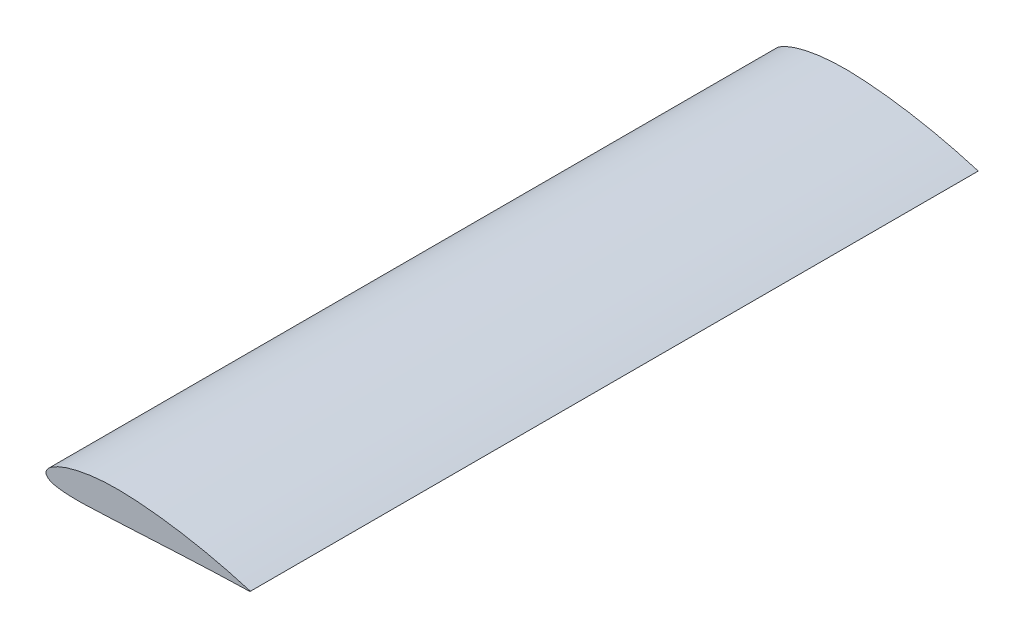
ISO-10303-21;
HEADER;
FILE_DESCRIPTION(('STEP AP214'),'2;1');
FILE_NAME('part.step','',(''),(''),'','','');
FILE_SCHEMA(('AUTOMOTIVE_DESIGN { 1 0 10303 214 1 1 1 1 }'));
ENDSEC;
DATA;
#1=APPLICATION_CONTEXT('core data for automotive mechanical design processes');
#2=APPLICATION_PROTOCOL_DEFINITION('international standard','automotive_design',2000,#1);
#3=PRODUCT_CONTEXT('',#1,'mechanical');
#4=PRODUCT('Part','Part','',(#3));
#5=PRODUCT_RELATED_PRODUCT_CATEGORY('part','',(#4));
#6=PRODUCT_DEFINITION_FORMATION('','',#4);
#7=PRODUCT_DEFINITION_CONTEXT('part definition',#1,'design');
#8=PRODUCT_DEFINITION('design','',#6,#7);
#9=PRODUCT_DEFINITION_SHAPE('','',#8);
#10=(LENGTH_UNIT() NAMED_UNIT(*) SI_UNIT(.MILLI.,.METRE.));
#11=(NAMED_UNIT(*) PLANE_ANGLE_UNIT() SI_UNIT($,.RADIAN.));
#12=(NAMED_UNIT(*) SI_UNIT($,.STERADIAN.) SOLID_ANGLE_UNIT());
#13=UNCERTAINTY_MEASURE_WITH_UNIT(LENGTH_MEASURE(1.E-05),#10,'distance_accuracy_value','');
#14=(GEOMETRIC_REPRESENTATION_CONTEXT(3) GLOBAL_UNCERTAINTY_ASSIGNED_CONTEXT((#13)) GLOBAL_UNIT_ASSIGNED_CONTEXT((#10,
#11,#12)) REPRESENTATION_CONTEXT('',''));
#15=CARTESIAN_POINT('',(0.,0.,0.));
#16=DIRECTION('',(0.,0.,1.));
#17=DIRECTION('',(1.,0.,0.));
#18=AXIS2_PLACEMENT_3D('',#15,#16,#17);
#19=CARTESIAN_POINT('',(0.404826448585652,2.27763507900381,500.));
#20=DIRECTION('',(0.,0.,-1.));
#21=DIRECTION('',(-1.,0.,0.));
#22=AXIS2_PLACEMENT_3D('',#19,#20,#21);
#23=PLANE('',#22);
#24=CARTESIAN_POINT('',(140.02716,0.203980000000014,500.));
#25=CARTESIAN_POINT('',(139.956789164407,0.225221614482348,500.));
#26=CARTESIAN_POINT('',(139.675665524009,0.310079495461967,500.));
#27=CARTESIAN_POINT('',(139.044498575236,0.499628042540923,500.));
#28=CARTESIAN_POINT('',(137.996224381688,0.811560707731416,500.));
#29=CARTESIAN_POINT('',(136.536433819815,1.24004769538334,500.));
#30=CARTESIAN_POINT('',(134.672905149545,1.77703214134827,500.));
#31=CARTESIAN_POINT('',(132.415637549044,2.41285187336849,500.));
#32=CARTESIAN_POINT('',(129.776846288305,3.13588639968204,500.));
#33=CARTESIAN_POINT('',(126.771112785758,3.93369295315949,500.));
#34=CARTESIAN_POINT('',(123.415248342765,4.79279186121189,500.));
#35=CARTESIAN_POINT('',(119.728052254295,5.69839562087959,500.));
#36=CARTESIAN_POINT('',(115.730741779321,6.63628033170199,500.));
#37=CARTESIAN_POINT('',(111.446385502148,7.59123371500353,500.));
#38=CARTESIAN_POINT('',(106.900008862267,8.54811777631246,500.));
#39=CARTESIAN_POINT('',(102.11855960554,9.49244534886887,500.));
#40=CARTESIAN_POINT('',(97.1306342164976,10.4094157862568,500.));
#41=CARTESIAN_POINT('',(91.9664102677575,11.2849755639074,500.));
#42=CARTESIAN_POINT('',(86.6574126094523,12.1050385678699,500.));
#43=CARTESIAN_POINT('',(81.236388980716,12.8570299790795,500.));
#44=CARTESIAN_POINT('',(75.7371009401458,13.5278385740999,500.));
#45=CARTESIAN_POINT('',(70.1942324093874,14.1062599715892,500.));
#46=CARTESIAN_POINT('',(64.6430465460116,14.5819773965765,500.));
#47=CARTESIAN_POINT('',(59.1044988145988,14.9449603694939,500.));
#48=CARTESIAN_POINT('',(53.5949828455513,15.1933641453371,500.));
#49=CARTESIAN_POINT('',(48.1486500652942,15.2539109214711,500.));
#50=CARTESIAN_POINT('',(42.8194940736059,15.1314064960747,500.));
#51=CARTESIAN_POINT('',(37.6645384335811,14.8278117397698,500.));
#52=CARTESIAN_POINT('',(32.721013927537,14.3505845804176,500.));
#53=CARTESIAN_POINT('',(28.0243854111276,13.7112812989703,500.));
#54=CARTESIAN_POINT('',(23.608012874332,12.9240931556622,500.));
#55=CARTESIAN_POINT('',(19.5026211339542,12.0062678345121,500.));
#56=CARTESIAN_POINT('',(15.7359111417993,10.9777061910959,500.));
#57=CARTESIAN_POINT('',(12.3325411815223,9.85913447746707,500.));
#58=CARTESIAN_POINT('',(9.31318480721374,8.67337607412427,500.));
#59=CARTESIAN_POINT('',(6.69490403739945,7.44244006941027,500.));
#60=CARTESIAN_POINT('',(4.4905558444516,6.18766147729643,500.));
#61=CARTESIAN_POINT('',(2.70840114542649,4.92797980027153,500.));
#62=CARTESIAN_POINT('',(1.35228918277038,3.67677063274474,500.));
#63=CARTESIAN_POINT('',(0.422250394410197,2.43914829508015,500.));
#64=CARTESIAN_POINT('',(-0.0704433076460615,1.20187014734243,500.));
#65=CARTESIAN_POINT('',(-0.077377808805779,-0.0155425075349178,500.));
#66=CARTESIAN_POINT('',(0.396195143578908,-1.13486449084059,500.));
#67=CARTESIAN_POINT('',(1.31323794825806,-2.08980898964254,500.));
#68=CARTESIAN_POINT('',(2.61664142607889,-2.89089635641442,500.));
#69=CARTESIAN_POINT('',(4.29704123511491,-3.56317367775761,500.));
#70=CARTESIAN_POINT('',(6.3480018888662,-4.11610254754229,500.));
#71=CARTESIAN_POINT('',(8.75913079835625,-4.55450469711747,500.));
#72=CARTESIAN_POINT('',(11.5160065683426,-4.8826500983735,500.));
#73=CARTESIAN_POINT('',(14.6016276176691,-5.10580988203923,500.));
#74=CARTESIAN_POINT('',(17.9973187831287,-5.23050109456169,500.));
#75=CARTESIAN_POINT('',(21.6830590843005,-5.26478673798973,500.));
#76=CARTESIAN_POINT('',(25.6380804310704,-5.2188970225612,500.));
#77=CARTESIAN_POINT('',(29.840828227253,-5.10415692979439,500.));
#78=CARTESIAN_POINT('',(34.2692146276758,-4.93322913419527,500.));
#79=CARTESIAN_POINT('',(38.9004770271151,-4.72015951338447,500.));
#80=CARTESIAN_POINT('',(43.711199328192,-4.47993319920713,500.));
#81=CARTESIAN_POINT('',(48.6771365915648,-4.22752148181516,500.));
#82=CARTESIAN_POINT('',(53.791929218503,-3.97517312980894,500.));
#83=CARTESIAN_POINT('',(59.0435545788623,-3.74433201324976,500.));
#84=CARTESIAN_POINT('',(64.3997997730417,-3.4807902478649,500.));
#85=CARTESIAN_POINT('',(69.8108585871143,-3.201291868649,500.));
#86=CARTESIAN_POINT('',(75.2301020814417,-2.91426609005164,500.));
#87=CARTESIAN_POINT('',(80.6251958246626,-2.6275528848076,500.));
#88=CARTESIAN_POINT('',(85.9636812748627,-2.34795621616198,500.));
#89=CARTESIAN_POINT('',(91.2130148357345,-2.0804474575052,500.));
#90=CARTESIAN_POINT('',(96.3409170930741,-1.82925450909069,500.));
#91=CARTESIAN_POINT('',(101.315399411902,-1.59671187508793,500.));
#92=CARTESIAN_POINT('',(106.10523935564,-1.38436743609644,500.));
#93=CARTESIAN_POINT('',(110.679963839704,-1.19288029389329,500.));
#94=CARTESIAN_POINT('',(115.010291079431,-1.02158789581474,500.));
#95=CARTESIAN_POINT('',(119.068135991926,-0.869967551339208,500.));
#96=CARTESIAN_POINT('',(122.827026690065,-0.736722937412343,500.));
#97=CARTESIAN_POINT('',(126.262097544598,-0.620892102779046,500.));
#98=CARTESIAN_POINT('',(129.350471616447,-0.521024926129598,500.));
#99=CARTESIAN_POINT('',(132.071299286858,-0.436344517829494,500.));
#100=CARTESIAN_POINT('',(134.406136442625,-0.365638747434759,500.));
#101=CARTESIAN_POINT('',(136.33894196305,-0.308592109231638,500.));
#102=CARTESIAN_POINT('',(137.856451785526,-0.264409061113069,500.));
#103=CARTESIAN_POINT('',(138.948036515316,-0.233117796124669,500.));
#104=CARTESIAN_POINT('',(139.621406881049,-0.214039876628817,500.));
#105=CARTESIAN_POINT('',(139.930024579776,-0.205204854599995,500.));
#106=CARTESIAN_POINT('',(140.018796806992,-0.202665082785585,500.));
#107=B_SPLINE_CURVE_WITH_KNOTS('',3,(#24,#25,#26,#27,#28,#29,#30,#31,#32,#33,#34,#35,#36,#37,
#38,#39,#40,#41,#42,#43,#44,#45,#46,#47,#48,#49,#50,#51,#52,#53,#54,#55,#56,#57,#58,#59,#60,#61,
#62,#63,#64,#65,#66,#67,#68,#69,#70,#71,#72,#73,#74,#75,#76,#77,#78,#79,#80,#81,#82,#83,#84,#85,
#86,#87,#88,#89,#90,#91,#92,#93,#94,#95,#96,#97,#98,#99,#100,#101,#102,#103,#104,#105,#106),
.UNSPECIFIED.,.F.,.F.,(4,1,1,1,1,1,1,1,1,1,1,1,1,1,1,1,1,1,1,1,1,1,1,1,1,1,1,1,1,1,1,1,1,1,1,1,
1,1,1,1,1,1,1,1,1,1,1,1,1,1,1,1,1,1,1,1,1,1,1,1,1,1,1,1,1,1,1,1,1,1,1,1,1,1,1,1,1,1,1,1,4),(0.,
0.000765130769244524,0.00305661209529914,0.00685965866343209,0.0121494072683618,
0.0188925332976978,0.0270462263354811,0.036559370649623,0.0473717724666816,0.0594157806242667,
0.0726163879325896,0.0868916573026751,0.10215276829467,0.118305464017637,0.135250369014953,
0.152882702447659,0.171093067984952,0.189769869151045,0.208797162579736,0.22805825047004,
0.247433292879836,0.266802990255714,0.286048293434919,0.305204432528419,0.324202365555451,
0.342730632005811,0.36067914332664,0.377940972438308,0.394414282166585,0.410003847372115,
0.424621473054428,0.438187350081377,0.450630882305105,0.461893566430374,0.471931937961665,
0.480721044479205,0.488262835911895,0.494602302954352,0.499854540793154,0.504257180365687,
0.508228707867405,0.512199847689362,0.51658892059262,0.521790216513113,0.528017933142941,
0.535367185905355,0.54386649047139,0.553505568972509,0.564252677358332,0.576059862122198,
0.58886938605381,0.602615469366401,0.617228103730882,0.632630671763226,0.648744088065116,
0.665485527558587,0.68276768508984,0.700501138454311,0.718789846760451,0.737484301576945,
0.75632139416763,0.77518847252562,0.793972092477878,0.812558003919144,0.830832750700832,
0.848683119557139,0.865998140681247,0.882668481494707,0.898589333210652,0.913657957121903,
0.927777935623076,0.940856759647301,0.952808686344022,0.963553789330579,0.973020343249466,
0.981143405483448,0.987868175453762,0.993147615856128,0.996945811456687,0.999235114127682,
1.000159519581),.UNSPECIFIED.);
#108=CARTESIAN_POINT('',(140.02716,0.203980000000014,500.));
#109=VERTEX_POINT('',#108);
#110=CARTESIAN_POINT('',(0.4006399206441,2.26986673609049,500.));
#111=VERTEX_POINT('',#110);
#112=EDGE_CURVE('E106',#109,#111,#107,.T.);
#113=ORIENTED_EDGE('',*,*,#112,.T.);
#114=CARTESIAN_POINT('',(140.018796806992,-0.202665082785585,500.));
#115=VERTEX_POINT('',#114);
#116=EDGE_CURVE('E161',#111,#115,#107,.T.);
#117=ORIENTED_EDGE('',*,*,#116,.T.);
#118=CARTESIAN_POINT('',(139.966139433366,0.00182642707064306,500.));
#119=DIRECTION('',(0.,0.,1.));
#120=DIRECTION('',(1.,0.,0.));
#121=AXIS2_PLACEMENT_3D('',#118,#119,#120);
#122=CIRCLE('',#121,0.211162441263678);
#123=EDGE_CURVE('E12',#115,#109,#122,.T.);
#124=ORIENTED_EDGE('',*,*,#123,.T.);
#125=EDGE_LOOP('',(#113,#117,#124));
#126=FACE_BOUND('',#125,.T.);
#127=ADVANCED_FACE('F95',(#126),#23,.F.);
#128=CARTESIAN_POINT('',(0.404826448585637,2.27763507900378,0.));
#129=DIRECTION('',(0.,0.,-1.));
#130=DIRECTION('',(-1.,0.,0.));
#131=AXIS2_PLACEMENT_3D('',#128,#129,#130);
#132=PLANE('',#131);
#133=CARTESIAN_POINT('',(140.02716,0.20398000000001,0.));
#134=CARTESIAN_POINT('',(139.956789164407,0.225221614482345,0.));
#135=CARTESIAN_POINT('',(139.675665524009,0.310079495461966,0.));
#136=CARTESIAN_POINT('',(139.044498575236,0.499628042540923,0.));
#137=CARTESIAN_POINT('',(137.996224381688,0.811560707731416,0.));
#138=CARTESIAN_POINT('',(136.536433819815,1.24004769538334,0.));
#139=CARTESIAN_POINT('',(134.672905149545,1.77703214134827,0.));
#140=CARTESIAN_POINT('',(132.415637549044,2.41285187336849,0.));
#141=CARTESIAN_POINT('',(129.776846288305,3.13588639968204,0.));
#142=CARTESIAN_POINT('',(126.771112785758,3.93369295315949,0.));
#143=CARTESIAN_POINT('',(123.415248342765,4.79279186121189,0.));
#144=CARTESIAN_POINT('',(119.728052254295,5.69839562087959,0.));
#145=CARTESIAN_POINT('',(115.730741779321,6.63628033170199,0.));
#146=CARTESIAN_POINT('',(111.446385502148,7.59123371500353,0.));
#147=CARTESIAN_POINT('',(106.900008862267,8.54811777631246,0.));
#148=CARTESIAN_POINT('',(102.11855960554,9.49244534886887,0.));
#149=CARTESIAN_POINT('',(97.1306342164976,10.4094157862568,0.));
#150=CARTESIAN_POINT('',(91.9664102677575,11.2849755639074,0.));
#151=CARTESIAN_POINT('',(86.6574126094523,12.1050385678699,0.));
#152=CARTESIAN_POINT('',(81.236388980716,12.8570299790795,0.));
#153=CARTESIAN_POINT('',(75.7371009401458,13.5278385740999,0.));
#154=CARTESIAN_POINT('',(70.1942324093874,14.1062599715892,0.));
#155=CARTESIAN_POINT('',(64.6430465460116,14.5819773965765,0.));
#156=CARTESIAN_POINT('',(59.1044988145988,14.9449603694939,0.));
#157=CARTESIAN_POINT('',(53.5949828455513,15.1933641453371,0.));
#158=CARTESIAN_POINT('',(48.1486500652942,15.2539109214711,0.));
#159=CARTESIAN_POINT('',(42.8194940736059,15.1314064960747,0.));
#160=CARTESIAN_POINT('',(37.6645384335811,14.8278117397698,0.));
#161=CARTESIAN_POINT('',(32.721013927537,14.3505845804176,0.));
#162=CARTESIAN_POINT('',(28.0243854111276,13.7112812989703,0.));
#163=CARTESIAN_POINT('',(23.608012874332,12.9240931556622,0.));
#164=CARTESIAN_POINT('',(19.5026211339542,12.0062678345121,0.));
#165=CARTESIAN_POINT('',(15.7359111417993,10.9777061910959,0.));
#166=CARTESIAN_POINT('',(12.3325411815223,9.85913447746707,0.));
#167=CARTESIAN_POINT('',(9.31318480721374,8.67337607412427,0.));
#168=CARTESIAN_POINT('',(6.69490403739945,7.44244006941027,0.));
#169=CARTESIAN_POINT('',(4.4905558444516,6.18766147729643,0.));
#170=CARTESIAN_POINT('',(2.70840114542649,4.92797980027153,0.));
#171=CARTESIAN_POINT('',(1.35228918277038,3.67677063274474,0.));
#172=CARTESIAN_POINT('',(0.422250394410197,2.43914829508015,0.));
#173=CARTESIAN_POINT('',(-0.0704433076460615,1.20187014734243,0.));
#174=CARTESIAN_POINT('',(-0.077377808805779,-0.0155425075349178,0.));
#175=CARTESIAN_POINT('',(0.396195143578908,-1.13486449084059,0.));
#176=CARTESIAN_POINT('',(1.31323794825806,-2.08980898964254,0.));
#177=CARTESIAN_POINT('',(2.61664142607889,-2.89089635641442,0.));
#178=CARTESIAN_POINT('',(4.29704123511491,-3.56317367775761,0.));
#179=CARTESIAN_POINT('',(6.3480018888662,-4.11610254754229,0.));
#180=CARTESIAN_POINT('',(8.75913079835625,-4.55450469711747,0.));
#181=CARTESIAN_POINT('',(11.5160065683426,-4.8826500983735,0.));
#182=CARTESIAN_POINT('',(14.6016276176691,-5.10580988203923,0.));
#183=CARTESIAN_POINT('',(17.9973187831287,-5.23050109456169,0.));
#184=CARTESIAN_POINT('',(21.6830590843005,-5.26478673798973,0.));
#185=CARTESIAN_POINT('',(25.6380804310704,-5.2188970225612,0.));
#186=CARTESIAN_POINT('',(29.840828227253,-5.10415692979439,0.));
#187=CARTESIAN_POINT('',(34.2692146276758,-4.93322913419527,0.));
#188=CARTESIAN_POINT('',(38.9004770271151,-4.72015951338447,0.));
#189=CARTESIAN_POINT('',(43.711199328192,-4.47993319920713,0.));
#190=CARTESIAN_POINT('',(48.6771365915648,-4.22752148181516,0.));
#191=CARTESIAN_POINT('',(53.791929218503,-3.97517312980894,0.));
#192=CARTESIAN_POINT('',(59.0435545788623,-3.74433201324976,0.));
#193=CARTESIAN_POINT('',(64.3997997730417,-3.4807902478649,0.));
#194=CARTESIAN_POINT('',(69.8108585871143,-3.201291868649,0.));
#195=CARTESIAN_POINT('',(75.2301020814417,-2.91426609005164,0.));
#196=CARTESIAN_POINT('',(80.6251958246626,-2.6275528848076,0.));
#197=CARTESIAN_POINT('',(85.9636812748627,-2.34795621616198,0.));
#198=CARTESIAN_POINT('',(91.2130148357345,-2.0804474575052,0.));
#199=CARTESIAN_POINT('',(96.3409170930741,-1.82925450909069,0.));
#200=CARTESIAN_POINT('',(101.315399411902,-1.59671187508793,0.));
#201=CARTESIAN_POINT('',(106.10523935564,-1.38436743609644,0.));
#202=CARTESIAN_POINT('',(110.679963839704,-1.19288029389329,0.));
#203=CARTESIAN_POINT('',(115.010291079431,-1.02158789581474,0.));
#204=CARTESIAN_POINT('',(119.068135991926,-0.869967551339208,0.));
#205=CARTESIAN_POINT('',(122.827026690065,-0.736722937412343,0.));
#206=CARTESIAN_POINT('',(126.262097544598,-0.620892102779046,0.));
#207=CARTESIAN_POINT('',(129.350471616447,-0.521024926129598,0.));
#208=CARTESIAN_POINT('',(132.071299286858,-0.436344517829494,0.));
#209=CARTESIAN_POINT('',(134.406136442625,-0.365638747434759,0.));
#210=CARTESIAN_POINT('',(136.33894196305,-0.308592109231638,0.));
#211=CARTESIAN_POINT('',(137.856451785526,-0.264409061113069,0.));
#212=CARTESIAN_POINT('',(138.948036515316,-0.233117796124669,0.));
#213=CARTESIAN_POINT('',(139.621406881049,-0.214039876628817,0.));
#214=CARTESIAN_POINT('',(139.930024579776,-0.205204854599995,0.));
#215=CARTESIAN_POINT('',(140.018796806992,-0.202665082785585,0.));
#216=B_SPLINE_CURVE_WITH_KNOTS('',3,(#133,#134,#135,#136,#137,#138,#139,#140,#141,#142,#143,
#144,#145,#146,#147,#148,#149,#150,#151,#152,#153,#154,#155,#156,#157,#158,#159,#160,#161,#162,
#163,#164,#165,#166,#167,#168,#169,#170,#171,#172,#173,#174,#175,#176,#177,#178,#179,#180,#181,
#182,#183,#184,#185,#186,#187,#188,#189,#190,#191,#192,#193,#194,#195,#196,#197,#198,#199,#200,
#201,#202,#203,#204,#205,#206,#207,#208,#209,#210,#211,#212,#213,#214,#215),.UNSPECIFIED.,.F.,
.F.,(4,1,1,1,1,1,1,1,1,1,1,1,1,1,1,1,1,1,1,1,1,1,1,1,1,1,1,1,1,1,1,1,1,1,1,1,1,1,1,1,1,1,1,1,1,
1,1,1,1,1,1,1,1,1,1,1,1,1,1,1,1,1,1,1,1,1,1,1,1,1,1,1,1,1,1,1,1,1,1,1,4),(0.,
0.000765130769244524,0.00305661209529914,0.00685965866343209,0.0121494072683618,
0.0188925332976978,0.0270462263354811,0.036559370649623,0.0473717724666816,0.0594157806242667,
0.0726163879325896,0.0868916573026751,0.10215276829467,0.118305464017637,0.135250369014953,
0.152882702447659,0.171093067984952,0.189769869151045,0.208797162579736,0.22805825047004,
0.247433292879836,0.266802990255714,0.286048293434919,0.305204432528419,0.324202365555451,
0.342730632005811,0.36067914332664,0.377940972438308,0.394414282166585,0.410003847372115,
0.424621473054428,0.438187350081377,0.450630882305105,0.461893566430374,0.471931937961665,
0.480721044479205,0.488262835911895,0.494602302954352,0.499854540793154,0.504257180365687,
0.508228707867405,0.512199847689362,0.51658892059262,0.521790216513113,0.528017933142941,
0.535367185905355,0.54386649047139,0.553505568972509,0.564252677358332,0.576059862122198,
0.58886938605381,0.602615469366401,0.617228103730882,0.632630671763226,0.648744088065116,
0.665485527558587,0.68276768508984,0.700501138454311,0.718789846760451,0.737484301576945,
0.75632139416763,0.77518847252562,0.793972092477878,0.812558003919144,0.830832750700832,
0.848683119557139,0.865998140681247,0.882668481494707,0.898589333210652,0.913657957121903,
0.927777935623076,0.940856759647301,0.952808686344022,0.963553789330579,0.973020343249466,
0.981143405483448,0.987868175453762,0.993147615856128,0.996945811456687,0.999235114127682,
1.000159519581),.UNSPECIFIED.);
#217=CARTESIAN_POINT('',(140.02716,0.203979999999998,0.));
#218=VERTEX_POINT('',#217);
#219=CARTESIAN_POINT('',(0.400639920644075,2.26986673609044,0.));
#220=VERTEX_POINT('',#219);
#221=EDGE_CURVE('E138',#218,#220,#216,.T.);
#222=ORIENTED_EDGE('',*,*,#221,.F.);
#223=CARTESIAN_POINT('',(139.966139433366,0.00182642707064436,0.));
#224=DIRECTION('',(0.,0.,1.));
#225=DIRECTION('',(1.,0.,0.));
#226=AXIS2_PLACEMENT_3D('',#223,#224,#225);
#227=CIRCLE('',#226,0.211162441263653);
#228=CARTESIAN_POINT('',(140.018796806992,-0.202665082785587,0.));
#229=VERTEX_POINT('',#228);
#230=EDGE_CURVE('E132',#229,#218,#227,.T.);
#231=ORIENTED_EDGE('',*,*,#230,.F.);
#232=EDGE_CURVE('E136',#220,#229,#216,.T.);
#233=ORIENTED_EDGE('',*,*,#232,.F.);
#234=EDGE_LOOP('',(#222,#231,#233));
#235=FACE_BOUND('',#234,.T.);
#236=ADVANCED_FACE('F135',(#235),#132,.T.);
#237=CARTESIAN_POINT('',(0.400639920644075,2.26986673609044,0.));
#238=CARTESIAN_POINT('',(0.4006399206441,2.26986673609049,500.));
#239=CARTESIAN_POINT('',(0.225511674595506,1.93760872329469,0.));
#240=CARTESIAN_POINT('',(0.225511674595527,1.93760872329473,500.));
#241=CARTESIAN_POINT('',(-0.0520707566524498,1.23199248270748,0.));
#242=CARTESIAN_POINT('',(-0.0520707566524421,1.23199248270751,499.999999999999));
#243=CARTESIAN_POINT('',(-0.0919583939903609,0.0854888281847376,0.));
#244=CARTESIAN_POINT('',(-0.0919583939903695,0.0854888281848058,500.));
#245=CARTESIAN_POINT('',(0.313674420634313,-0.98871302476936,0.));
#246=CARTESIAN_POINT('',(0.313674420634307,-0.988713024769381,500.));
#247=CARTESIAN_POINT('',(1.05714802596974,-1.85057109005049,0.));
#248=CARTESIAN_POINT('',(1.05714802596973,-1.85057109005045,500.000000000001));
#249=CARTESIAN_POINT('',(1.97309524762181,-2.51326363868253,0.));
#250=CARTESIAN_POINT('',(1.97309524762179,-2.51326363868255,499.999999999999));
#251=CARTESIAN_POINT('',(2.97571326664325,-3.03090936326373,0.));
#252=CARTESIAN_POINT('',(2.97571326664324,-3.0309093632637,500.000000000001));
#253=CARTESIAN_POINT('',(4.02440513901362,-3.44384408775265,0.));
#254=CARTESIAN_POINT('',(4.0244051390136,-3.44384408775267,500.));
#255=CARTESIAN_POINT('',(5.09998260414016,-3.77976715824674,0.));
#256=CARTESIAN_POINT('',(5.0999826041402,-3.77976715824674,500.));
#257=CARTESIAN_POINT('',(6.19201207619287,-4.05607290939576,0.));
#258=CARTESIAN_POINT('',(6.19201207619285,-4.05607290939576,500.));
#259=CARTESIAN_POINT('',(7.29466710961048,-4.28620958030143,0.));
#260=CARTESIAN_POINT('',(7.29466710961051,-4.28620958030143,500.));
#261=CARTESIAN_POINT('',(8.40450021057562,-4.47805783781672,0.));
#262=CARTESIAN_POINT('',(8.40450021057562,-4.47805783781672,499.999999999999));
#263=CARTESIAN_POINT('',(9.51922498739068,-4.63899836052821,0.));
#264=CARTESIAN_POINT('',(9.51922498739076,-4.63899836052823,500.000000000001));
#265=CARTESIAN_POINT('',(10.6373878859051,-4.77357818714411,0.));
#266=CARTESIAN_POINT('',(10.6373878859051,-4.7735781871441,499.999999999999));
#267=CARTESIAN_POINT('',(12.1315822402004,-4.92305730108382,0.));
#268=CARTESIAN_POINT('',(12.1315822402004,-4.92305730108383,500.000000000001));
#269=CARTESIAN_POINT('',(14.0036145873657,-5.06194347668057,0.));
#270=CARTESIAN_POINT('',(14.0036145873656,-5.06194347668058,500.));
#271=CARTESIAN_POINT('',(16.2535350159055,-5.16975640637266,0.));
#272=CARTESIAN_POINT('',(16.2535350159055,-5.16975640637266,500.));
#273=CARTESIAN_POINT('',(18.5051521040251,-5.23111950013034,0.));
#274=CARTESIAN_POINT('',(18.5051521040251,-5.23111950013034,500.));
#275=CARTESIAN_POINT('',(20.7574391301915,-5.25524363091419,0.));
#276=CARTESIAN_POINT('',(20.7574391301915,-5.25524363091419,500.));
#277=CARTESIAN_POINT('',(23.0098293521398,-5.24924591224936,0.));
#278=CARTESIAN_POINT('',(23.0098293521399,-5.24924591224937,500.));
#279=CARTESIAN_POINT('',(25.2620034951151,-5.21862983129711,0.));
#280=CARTESIAN_POINT('',(25.262003495115,-5.21862983129711,500.000000000001));
#281=CARTESIAN_POINT('',(27.513807915801,-5.16792352498599,0.));
#282=CARTESIAN_POINT('',(27.513807915801,-5.16792352498598,500.));
#283=CARTESIAN_POINT('',(29.7651723077879,-5.10071316356713,0.));
#284=CARTESIAN_POINT('',(29.7651723077878,-5.10071316356713,500.));
#285=CARTESIAN_POINT('',(32.0160996622558,-5.02026326401737,0.));
#286=CARTESIAN_POINT('',(32.0160996622557,-5.02026326401738,500.));
#287=CARTESIAN_POINT('',(34.2666132073791,-4.92908330915017,0.));
#288=CARTESIAN_POINT('',(34.2666132073792,-4.92908330915017,500.));
#289=CARTESIAN_POINT('',(37.266840369698,-4.79668672177699,0.));
#290=CARTESIAN_POINT('',(37.2668403696978,-4.796686721777,500.));
#291=CARTESIAN_POINT('',(41.0163977375133,-4.61547311551079,0.));
#292=CARTESIAN_POINT('',(41.0163977375133,-4.61547311551079,500.));
#293=CARTESIAN_POINT('',(45.5153769661647,-4.38831009025086,0.));
#294=CARTESIAN_POINT('',(45.5153769661646,-4.38831009025086,500.));
#295=CARTESIAN_POINT('',(50.0143160840615,-4.16028457990531,0.));
#296=CARTESIAN_POINT('',(50.0143160840615,-4.16028457990531,500.));
#297=CARTESIAN_POINT('',(54.5138013173702,-3.94325023413711,0.));
#298=CARTESIAN_POINT('',(54.5138013173701,-3.94325023413711,500.));
#299=CARTESIAN_POINT('',(59.0141485928881,-3.74471316611654,0.));
#300=CARTESIAN_POINT('',(59.0141485928879,-3.74471316611655,499.999999999999));
#301=CARTESIAN_POINT('',(63.5134925707311,-3.52468101794534,0.));
#302=CARTESIAN_POINT('',(63.5134925707311,-3.52468101794534,500.000000000001));
#303=CARTESIAN_POINT('',(68.0123372003268,-3.29485274836468,0.));
#304=CARTESIAN_POINT('',(68.0123372003266,-3.29485274836469,499.999999999999));
#305=CARTESIAN_POINT('',(72.5108490905529,-3.05855251414875,0.));
#306=CARTESIAN_POINT('',(72.5108490905528,-3.05855251414875,500.000000000001));
#307=CARTESIAN_POINT('',(77.0092186665962,-2.81960993095866,0.));
#308=CARTESIAN_POINT('',(77.009218666596,-2.81960993095867,499.999999999999));
#309=CARTESIAN_POINT('',(81.5076167594491,-2.58117739640988,0.));
#310=CARTESIAN_POINT('',(81.5076167594488,-2.58117739640989,500.));
#311=CARTESIAN_POINT('',(86.0061921760374,-2.34612434012086,0.));
#312=CARTESIAN_POINT('',(86.0061921760373,-2.34612434012087,500.));
#313=CARTESIAN_POINT('',(90.5050438262346,-2.11638865071454,0.));
#314=CARTESIAN_POINT('',(90.5050438262344,-2.11638865071455,500.000000000001));
#315=CARTESIAN_POINT('',(95.0042687004221,-1.89409218954775,0.));
#316=CARTESIAN_POINT('',(95.0042687004219,-1.89409218954776,499.999999999999));
#317=CARTESIAN_POINT('',(99.5039110421805,-1.6803634462607,0.));
#318=CARTESIAN_POINT('',(99.5039110421803,-1.68036344626071,500.));
#319=CARTESIAN_POINT('',(105.504030312848,-1.4082998831083,0.));
#320=CARTESIAN_POINT('',(105.504030312848,-1.40829988310831,500.));
#321=CARTESIAN_POINT('',(113.005331981621,-1.09410156072387,0.));
#322=CARTESIAN_POINT('',(113.00533198162,-1.09410156072387,500.));
#323=CARTESIAN_POINT('',(122.008576017608,-0.75997285112838,0.));
#324=CARTESIAN_POINT('',(122.008576017608,-0.759972851128385,499.999999999999));
#325=CARTESIAN_POINT('',(131.013154689492,-0.463695304182744,0.));
#326=CARTESIAN_POINT('',(131.013154689493,-0.463695304182741,500.));
#327=CARTESIAN_POINT('',(137.016878591735,-0.288549908607573,0.));
#328=CARTESIAN_POINT('',(137.016878591735,-0.288549908607574,500.));
#329=CARTESIAN_POINT('',(140.018796806992,-0.202665082785585,0.));
#330=CARTESIAN_POINT('',(140.018796806992,-0.202665082785585,500.));
#331=B_SPLINE_SURFACE_WITH_KNOTS('',3,1,((#237,#238),(#239,#240),(#241,#242),(#243,#244),(#245,
#246),(#247,#248),(#249,#250),(#251,#252),(#253,#254),(#255,#256),(#257,#258),(#259,#260),(#261,
#262),(#263,#264),(#265,#266),(#267,#268),(#269,#270),(#271,#272),(#273,#274),(#275,#276),(#277,
#278),(#279,#280),(#281,#282),(#283,#284),(#285,#286),(#287,#288),(#289,#290),(#291,#292),(#293,
#294),(#295,#296),(#297,#298),(#299,#300),(#301,#302),(#303,#304),(#305,#306),(#307,#308),(#309,
#310),(#311,#312),(#313,#314),(#315,#316),(#317,#318),(#319,#320),(#321,#322),(#323,#324),(#325,
#326),(#327,#328),(#329,#330)),.UNSPECIFIED.,.F.,.F.,.F.,(4,1,1,1,1,1,1,1,1,1,1,1,1,1,1,1,1,1,1,
1,1,1,1,1,1,1,1,1,1,1,1,1,1,1,1,1,1,1,1,1,1,1,1,1,4),(2,2),(0.500949036928169,0.504847872577167,
0.508746708226166,0.512645543875165,0.516544379524164,0.520443215173162,0.524342050822161,
0.52824088647116,0.532139722120158,0.536038557769157,0.539937393418156,0.543836229067154,
0.547735064716153,0.551633900365152,0.555532736014151,0.563330407312148,0.571128078610145,
0.578925749908143,0.58672342120614,0.594521092504137,0.602318763802134,0.610116435100132,
0.617914106398129,0.625711777696127,0.633509448994124,0.641307120292121,0.656902462888116,
0.672497805484111,0.688093148080105,0.7036884906761,0.719283833272095,0.73487917586809,
0.750474518464085,0.766069861060079,0.781665203656074,0.797260546252069,0.812855888848063,
0.828451231444058,0.844046574040053,0.859641916636047,0.875237259232042,0.906427944424032,
0.937618629616021,0.96880931480801,1.),(0.,1.),.UNSPECIFIED.);
#332=DIRECTION('',(0.,0.,1.));
#333=VECTOR('',#332,1.);
#334=CARTESIAN_POINT('',(140.018796806992,-0.202665082785586,250.));
#335=LINE('',#334,#333);
#336=EDGE_CURVE('E152',#229,#115,#335,.T.);
#337=DIRECTION('',(0.,0.,1.));
#338=VECTOR('',#337,1.);
#339=CARTESIAN_POINT('',(0.400639920644087,2.26986673609047,250.));
#340=LINE('',#339,#338);
#341=EDGE_CURVE('E144',#220,#111,#340,.T.);
#342=ORIENTED_EDGE('',*,*,#232,.T.);
#343=ORIENTED_EDGE('',*,*,#336,.T.);
#344=ORIENTED_EDGE('',*,*,#116,.F.);
#345=ORIENTED_EDGE('',*,*,#341,.F.);
#346=EDGE_LOOP('',(#342,#343,#344,#345));
#347=FACE_BOUND('',#346,.T.);
#348=ADVANCED_FACE('F151',(#347),#331,.T.);
#349=CARTESIAN_POINT('',(140.018796806992,-0.202665082785587,0.));
#350=CARTESIAN_POINT('',(140.018796806992,-0.202665082785585,500.));
#351=CARTESIAN_POINT('',(140.063042098068,-0.191271745111071,0.));
#352=CARTESIAN_POINT('',(140.063042098068,-0.191271745111047,500.));
#353=CARTESIAN_POINT('',(140.143801244457,-0.138802453426607,0.));
#354=CARTESIAN_POINT('',(140.143801244457,-0.138802453426547,500.));
#355=CARTESIAN_POINT('',(140.192665624155,-0.00283238311842003,0.));
#356=CARTESIAN_POINT('',(140.192665624155,-0.00283238311834707,499.999999999999));
#357=CARTESIAN_POINT('',(140.149433007075,0.135031783521365,0.));
#358=CARTESIAN_POINT('',(140.149433007075,0.13503178352138,500.));
#359=CARTESIAN_POINT('',(140.070899437802,0.190777140212618,0.));
#360=CARTESIAN_POINT('',(140.070899437802,0.190777140212628,500.));
#361=CARTESIAN_POINT('',(137.152137336917,1.07181285323352,0.));
#362=CARTESIAN_POINT('',(137.152137336917,1.0718128532338,500.));
#363=CARTESIAN_POINT('',(131.380144011143,2.73468806856611,0.));
#364=CARTESIAN_POINT('',(131.380144011143,2.73468806856592,500.));
#365=CARTESIAN_POINT('',(122.662381412026,5.01126318686583,0.));
#366=CARTESIAN_POINT('',(122.662381412026,5.01126318686592,500.));
#367=CARTESIAN_POINT('',(113.893057333977,7.07999311649874,0.));
#368=CARTESIAN_POINT('',(113.893057333977,7.07999311649868,500.));
#369=CARTESIAN_POINT('',(105.077316386084,8.94117783227487,0.));
#370=CARTESIAN_POINT('',(105.077316386083,8.94117783227487,500.));
#371=CARTESIAN_POINT('',(97.6963535128986,10.3185402543548,0.));
#372=CARTESIAN_POINT('',(97.6963535128988,10.3185402543548,500.));
#373=CARTESIAN_POINT('',(91.7727691681037,11.3125848076591,0.));
#374=CARTESIAN_POINT('',(91.7727691681038,11.3125848076591,500.));
#375=CARTESIAN_POINT('',(87.3211418901981,12.0026454676775,0.));
#376=CARTESIAN_POINT('',(87.3211418901983,12.0026454676775,500.));
#377=CARTESIAN_POINT('',(82.8610799815796,12.6360696698612,0.));
#378=CARTESIAN_POINT('',(82.8610799815796,12.6360696698612,500.));
#379=CARTESIAN_POINT('',(78.3930165076918,13.2102322968379,0.));
#380=CARTESIAN_POINT('',(78.393016507692,13.2102322968379,500.));
#381=CARTESIAN_POINT('',(73.9174669734516,13.7231412461565,0.));
#382=CARTESIAN_POINT('',(73.9174669734516,13.7231412461565,499.999999999999));
#383=CARTESIAN_POINT('',(69.435002892394,14.1712424763279,0.));
#384=CARTESIAN_POINT('',(69.4350028923942,14.1712424763279,500.000000000001));
#385=CARTESIAN_POINT('',(64.9463114291014,14.5529584582279,0.));
#386=CARTESIAN_POINT('',(64.9463114291013,14.5529584582279,499.999999999999));
#387=CARTESIAN_POINT('',(60.4519401134777,14.8595233610418,0.));
#388=CARTESIAN_POINT('',(60.4519401134779,14.8595233610418,500.000000000001));
#389=CARTESIAN_POINT('',(55.9532947199483,15.0973385138518,0.));
#390=CARTESIAN_POINT('',(55.9532947199482,15.0973385138518,499.999999999999));
#391=CARTESIAN_POINT('',(51.4501471342812,15.2302181539063,0.));
#392=CARTESIAN_POINT('',(51.4501471342813,15.2302181539062,500.000000000001));
#393=CARTESIAN_POINT('',(46.9449288674518,15.2327310052195,0.));
#394=CARTESIAN_POINT('',(46.9449288674518,15.2327310052195,500.));
#395=CARTESIAN_POINT('',(42.4415032188828,15.1074841403814,0.));
#396=CARTESIAN_POINT('',(42.4415032188828,15.1074841403814,500.));
#397=CARTESIAN_POINT('',(37.9439963902632,14.8422171086125,0.));
#398=CARTESIAN_POINT('',(37.9439963902633,14.8422171086124,500.));
#399=CARTESIAN_POINT('',(33.4576288312662,14.4290736224199,0.));
#400=CARTESIAN_POINT('',(33.4576288312662,14.4290736224199,500.));
#401=CARTESIAN_POINT('',(28.9887178732628,13.8559717344301,0.));
#402=CARTESIAN_POINT('',(28.988717873263,13.8559717344301,499.999999999999));
#403=CARTESIAN_POINT('',(25.2859881543941,13.233328169886,0.));
#404=CARTESIAN_POINT('',(25.2859881543941,13.233328169886,500.000000000001));
#405=CARTESIAN_POINT('',(22.3421625941879,12.6382475342479,0.));
#406=CARTESIAN_POINT('',(22.342162594188,12.6382475342479,499.999999999999));
#407=CARTESIAN_POINT('',(20.1453850019047,12.1402814776766,0.));
#408=CARTESIAN_POINT('',(20.1453850019048,12.1402814776766,500.000000000001));
#409=CARTESIAN_POINT('',(17.9618096852632,11.5870900448563,0.));
#410=CARTESIAN_POINT('',(17.9618096852633,11.5870900448563,499.999999999999));
#411=CARTESIAN_POINT('',(15.7942802171977,10.9739081643558,0.));
#412=CARTESIAN_POINT('',(15.7942802171978,10.9739081643558,500.000000000001));
#413=CARTESIAN_POINT('',(13.6464134074551,10.2948536169564,0.));
#414=CARTESIAN_POINT('',(13.6464134074552,10.2948536169564,500.));
#415=CARTESIAN_POINT('',(11.5230194275443,9.54251829748712,0.));
#416=CARTESIAN_POINT('',(11.5230194275444,9.54251829748713,500.));
#417=CARTESIAN_POINT('',(9.77959160644141,8.84603099616977,0.));
#418=CARTESIAN_POINT('',(9.77959160644149,8.84603099616981,500.000000000001));
#419=CARTESIAN_POINT('',(8.40561250121303,8.2399637074007,0.));
#420=CARTESIAN_POINT('',(8.4056125012131,8.23996370740075,499.999999999999));
#421=CARTESIAN_POINT('',(7.38749912071759,7.75836656521083,0.));
#422=CARTESIAN_POINT('',(7.38749912071767,7.75836656521086,500.));
#423=CARTESIAN_POINT('',(6.3841066076102,7.24666777614797,0.));
#424=CARTESIAN_POINT('',(6.38410660761026,7.24666777614801,500.));
#425=CARTESIAN_POINT('',(5.39843943654087,6.70159980601726,0.));
#426=CARTESIAN_POINT('',(5.39843943654099,6.70159980601732,499.999999999999));
#427=CARTESIAN_POINT('',(4.43531812294103,6.11731618645684,0.));
#428=CARTESIAN_POINT('',(4.43531812294108,6.11731618645688,500.000000000001));
#429=CARTESIAN_POINT('',(3.50062208961308,5.48860920905789,0.));
#430=CARTESIAN_POINT('',(3.50062208961316,5.48860920905793,499.999999999999));
#431=CARTESIAN_POINT('',(2.60432944243926,4.80545433822869,0.));
#432=CARTESIAN_POINT('',(2.60432944243929,4.80545433822872,500.));
#433=CARTESIAN_POINT('',(1.76193652907752,4.05681102904661,0.));
#434=CARTESIAN_POINT('',(1.76193652907755,4.05681102904664,500.));
#435=CARTESIAN_POINT('',(0.998698719639044,3.22554055948217,0.));
#436=CARTESIAN_POINT('',(0.998698719639077,3.22554055948221,499.999999999999));
#437=CARTESIAN_POINT('',(0.575768166692661,2.60212474888624,0.));
#438=CARTESIAN_POINT('',(0.57576816669269,2.60212474888629,500.));
#439=CARTESIAN_POINT('',(0.400639920644075,2.26986673609044,0.));
#440=CARTESIAN_POINT('',(0.4006399206441,2.26986673609049,500.));
#441=B_SPLINE_SURFACE_WITH_KNOTS('',3,1,((#349,#350),(#351,#352),(#353,#354),(#355,#356),(#357,
#358),(#359,#360),(#361,#362),(#363,#364),(#365,#366),(#367,#368),(#369,#370),(#371,#372),(#373,
#374),(#375,#376),(#377,#378),(#379,#380),(#381,#382),(#383,#384),(#385,#386),(#387,#388),(#389,
#390),(#391,#392),(#393,#394),(#395,#396),(#397,#398),(#399,#400),(#401,#402),(#403,#404),(#405,
#406),(#407,#408),(#409,#410),(#411,#412),(#413,#414),(#415,#416),(#417,#418),(#419,#420),(#421,
#422),(#423,#424),(#425,#426),(#427,#428),(#429,#430),(#431,#432),(#433,#434),(#435,#436),(#437,
#438),(#439,#440)),.UNSPECIFIED.,.F.,.F.,.F.,(4,1,1,1,2,1,1,1,1,1,1,1,1,1,1,1,1,1,1,1,1,1,1,1,1,
1,1,1,1,1,1,1,1,1,1,1,1,1,1,1,1,1,4),(2,2),(0.,0.000474518464084504,0.000949036928169008,
0.00142355539225351,0.00189807385633802,0.0330887590483274,0.0642794442403169,
0.0954701294323063,0.126660814624296,0.157851499816285,0.17344684241228,0.189042185008275,
0.204637527604269,0.220232870200264,0.235828212796259,0.251423555392253,0.267018897988248,
0.282614240584243,0.298209583180238,0.313804925776232,0.329400268372227,0.344995610968222,
0.360590953564216,0.376186296160211,0.391781638756206,0.407376981352201,0.415174652650198,
0.422972323948195,0.430769995246193,0.43856766654419,0.446365337842187,0.454163009140185,
0.461960680438182,0.465859516087181,0.46975835173618,0.473657187385178,0.477556023034177,
0.481454858683176,0.485353694332174,0.489252529981173,0.493151365630172,0.49705020127917,
0.500949036928169),(0.,1.),.UNSPECIFIED.);
#442=ORIENTED_EDGE('',*,*,#230,.T.);
#443=ORIENTED_EDGE('',*,*,#221,.T.);
#444=ORIENTED_EDGE('',*,*,#341,.T.);
#445=ORIENTED_EDGE('',*,*,#112,.F.);
#446=ORIENTED_EDGE('',*,*,#123,.F.);
#447=ORIENTED_EDGE('',*,*,#336,.F.);
#448=EDGE_LOOP('',(#442,#443,#444,#445,#446,#447));
#449=FACE_BOUND('',#448,.T.);
#450=ADVANCED_FACE('F158',(#449),#441,.T.);
#451=CLOSED_SHELL('',(#127,#236,#348,#450));
#452=MANIFOLD_SOLID_BREP('B2',#451);
#453=ADVANCED_BREP_SHAPE_REPRESENTATION('',(#18,#452),#14);
#454=SHAPE_DEFINITION_REPRESENTATION(#9,#453);
ENDSEC;
END-ISO-10303-21;
